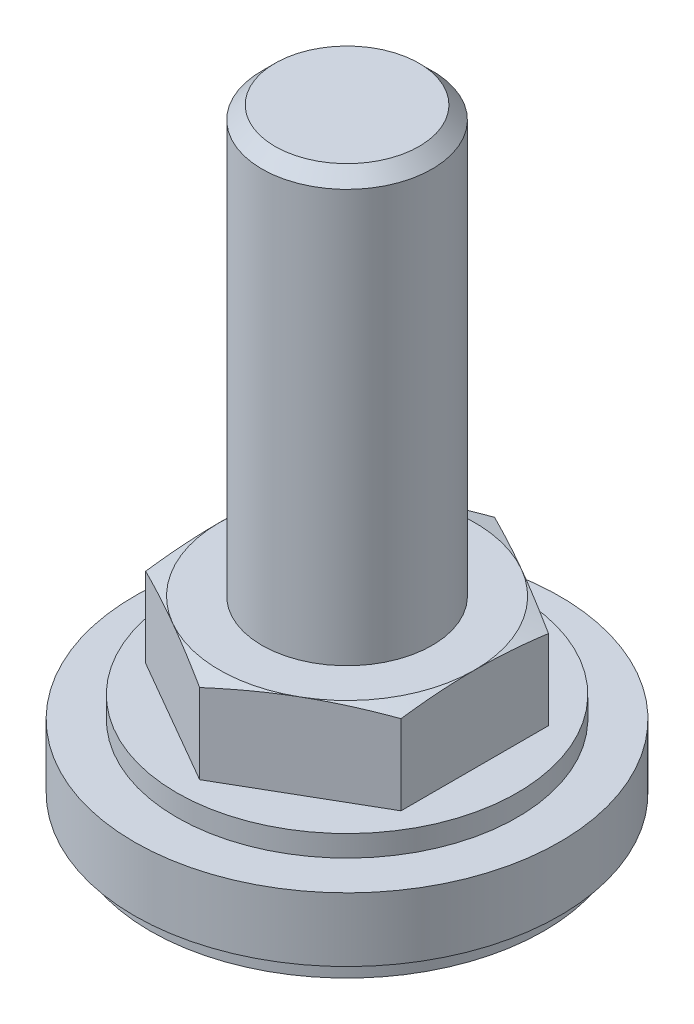
ISO-10303-21;
HEADER;
FILE_DESCRIPTION(('STEP AP214'),'2;1');
FILE_NAME('part.step','',(''),(''),'','','');
FILE_SCHEMA(('AUTOMOTIVE_DESIGN { 1 0 10303 214 1 1 1 1 }'));
ENDSEC;
DATA;
#1=APPLICATION_CONTEXT('core data for automotive mechanical design processes');
#2=APPLICATION_PROTOCOL_DEFINITION('international standard','automotive_design',2000,#1);
#3=PRODUCT_CONTEXT('',#1,'mechanical');
#4=PRODUCT('Part','Part','',(#3));
#5=PRODUCT_RELATED_PRODUCT_CATEGORY('part','',(#4));
#6=PRODUCT_DEFINITION_FORMATION('','',#4);
#7=PRODUCT_DEFINITION_CONTEXT('part definition',#1,'design');
#8=PRODUCT_DEFINITION('design','',#6,#7);
#9=PRODUCT_DEFINITION_SHAPE('','',#8);
#10=(LENGTH_UNIT() NAMED_UNIT(*) SI_UNIT(.MILLI.,.METRE.));
#11=(NAMED_UNIT(*) PLANE_ANGLE_UNIT() SI_UNIT($,.RADIAN.));
#12=(NAMED_UNIT(*) SI_UNIT($,.STERADIAN.) SOLID_ANGLE_UNIT());
#13=UNCERTAINTY_MEASURE_WITH_UNIT(LENGTH_MEASURE(1.E-05),#10,'distance_accuracy_value','');
#14=(GEOMETRIC_REPRESENTATION_CONTEXT(3) GLOBAL_UNCERTAINTY_ASSIGNED_CONTEXT((#13)) GLOBAL_UNIT_ASSIGNED_CONTEXT((#10,
#11,#12)) REPRESENTATION_CONTEXT('',''));
#15=CARTESIAN_POINT('',(0.,0.,0.));
#16=DIRECTION('',(0.,0.,1.));
#17=DIRECTION('',(1.,0.,0.));
#18=AXIS2_PLACEMENT_3D('',#15,#16,#17);
#19=CARTESIAN_POINT('',(15.,2.,0.));
#20=DIRECTION('',(0.,-1.,0.));
#21=DIRECTION('',(0.,0.,-1.));
#22=AXIS2_PLACEMENT_3D('',#19,#20,#21);
#23=PLANE('',#22);
#24=CARTESIAN_POINT('',(0.,2.,0.));
#25=DIRECTION('',(0.,1.,0.));
#26=DIRECTION('',(0.,0.,1.));
#27=AXIS2_PLACEMENT_3D('',#24,#25,#26);
#28=CIRCLE('',#27,16.);
#29=CARTESIAN_POINT('',(0.,2.,16.));
#30=VERTEX_POINT('',#29);
#31=EDGE_CURVE('E163',#30,#30,#28,.T.);
#32=ORIENTED_EDGE('',*,*,#31,.T.);
#33=EDGE_LOOP('',(#32));
#34=FACE_BOUND('',#33,.T.);
#35=DIRECTION('',(-0.866025403784439,0.,0.5));
#36=VECTOR('',#35,1.);
#37=CARTESIAN_POINT('',(0.,2.,-13.856406460551));
#38=LINE('',#37,#36);
#39=CARTESIAN_POINT('',(0.,2.,-13.856406460551));
#40=VERTEX_POINT('',#39);
#41=CARTESIAN_POINT('',(-12.,2.,-6.9282032302755));
#42=VERTEX_POINT('',#41);
#43=EDGE_CURVE('E124',#40,#42,#38,.T.);
#44=ORIENTED_EDGE('',*,*,#43,.F.);
#45=DIRECTION('',(-0.866025403784439,0.,-0.5));
#46=VECTOR('',#45,1.);
#47=CARTESIAN_POINT('',(12.,2.,-6.9282032302755));
#48=LINE('',#47,#46);
#49=CARTESIAN_POINT('',(12.,2.,-6.9282032302755));
#50=VERTEX_POINT('',#49);
#51=EDGE_CURVE('E139',#50,#40,#48,.T.);
#52=ORIENTED_EDGE('',*,*,#51,.F.);
#53=DIRECTION('',(0.,0.,-1.));
#54=VECTOR('',#53,1.);
#55=CARTESIAN_POINT('',(12.,2.,6.9282032302755));
#56=LINE('',#55,#54);
#57=CARTESIAN_POINT('',(12.,2.,6.9282032302755));
#58=VERTEX_POINT('',#57);
#59=EDGE_CURVE('E136',#58,#50,#56,.T.);
#60=ORIENTED_EDGE('',*,*,#59,.F.);
#61=DIRECTION('',(0.866025403784439,0.,-0.5));
#62=VECTOR('',#61,1.);
#63=CARTESIAN_POINT('',(0.,2.,13.856406460551));
#64=LINE('',#63,#62);
#65=CARTESIAN_POINT('',(0.,2.,13.856406460551));
#66=VERTEX_POINT('',#65);
#67=EDGE_CURVE('E133',#66,#58,#64,.T.);
#68=ORIENTED_EDGE('',*,*,#67,.F.);
#69=DIRECTION('',(0.866025403784439,0.,0.5));
#70=VECTOR('',#69,1.);
#71=CARTESIAN_POINT('',(-12.,2.,6.9282032302755));
#72=LINE('',#71,#70);
#73=CARTESIAN_POINT('',(-12.,2.,6.9282032302755));
#74=VERTEX_POINT('',#73);
#75=EDGE_CURVE('E127',#74,#66,#72,.T.);
#76=ORIENTED_EDGE('',*,*,#75,.F.);
#77=DIRECTION('',(0.,0.,1.));
#78=VECTOR('',#77,1.);
#79=CARTESIAN_POINT('',(-12.,2.,-6.9282032302755));
#80=LINE('',#79,#78);
#81=EDGE_CURVE('E113',#42,#74,#80,.T.);
#82=ORIENTED_EDGE('',*,*,#81,.F.);
#83=EDGE_LOOP('',(#44,#52,#60,#68,#76,#82));
#84=FACE_BOUND('',#83,.T.);
#85=ADVANCED_FACE('F35',(#34,#84),#23,.F.);
#86=CARTESIAN_POINT('',(0.,-8.,0.));
#87=DIRECTION('',(0.,1.,0.));
#88=DIRECTION('',(0.,0.,1.));
#89=AXIS2_PLACEMENT_3D('',#86,#87,#88);
#90=CYLINDRICAL_SURFACE('',#89,16.);
#91=ORIENTED_EDGE('',*,*,#31,.F.);
#92=EDGE_LOOP('',(#91));
#93=FACE_BOUND('',#92,.T.);
#94=CARTESIAN_POINT('',(0.,0.,0.));
#95=DIRECTION('',(0.,1.,0.));
#96=DIRECTION('',(0.,0.,1.));
#97=AXIS2_PLACEMENT_3D('',#94,#95,#96);
#98=CIRCLE('',#97,16.);
#99=CARTESIAN_POINT('',(0.,0.,16.));
#100=VERTEX_POINT('',#99);
#101=EDGE_CURVE('E160',#100,#100,#98,.T.);
#102=ORIENTED_EDGE('',*,*,#101,.T.);
#103=EDGE_LOOP('',(#102));
#104=FACE_BOUND('',#103,.T.);
#105=ADVANCED_FACE('F257',(#93,#104),#90,.T.);
#106=CARTESIAN_POINT('',(16.,0.,0.));
#107=DIRECTION('',(0.,-1.,0.));
#108=DIRECTION('',(0.,0.,-1.));
#109=AXIS2_PLACEMENT_3D('',#106,#107,#108);
#110=PLANE('',#109);
#111=ORIENTED_EDGE('',*,*,#101,.F.);
#112=EDGE_LOOP('',(#111));
#113=FACE_BOUND('',#112,.T.);
#114=CARTESIAN_POINT('',(0.,0.,0.));
#115=DIRECTION('',(0.,1.,0.));
#116=DIRECTION('',(0.,0.,1.));
#117=AXIS2_PLACEMENT_3D('',#114,#115,#116);
#118=CIRCLE('',#117,20.);
#119=CARTESIAN_POINT('',(0.,0.,20.));
#120=VERTEX_POINT('',#119);
#121=EDGE_CURVE('E157',#120,#120,#118,.T.);
#122=ORIENTED_EDGE('',*,*,#121,.T.);
#123=EDGE_LOOP('',(#122));
#124=FACE_BOUND('',#123,.T.);
#125=ADVANCED_FACE('F253',(#113,#124),#110,.F.);
#126=CARTESIAN_POINT('',(0.,-8.,0.));
#127=DIRECTION('',(0.,1.,0.));
#128=DIRECTION('',(0.,0.,1.));
#129=AXIS2_PLACEMENT_3D('',#126,#127,#128);
#130=CYLINDRICAL_SURFACE('',#129,20.);
#131=ORIENTED_EDGE('',*,*,#121,.F.);
#132=EDGE_LOOP('',(#131));
#133=FACE_BOUND('',#132,.T.);
#134=CARTESIAN_POINT('',(0.,-6.,0.));
#135=DIRECTION('',(0.,1.,0.));
#136=DIRECTION('',(0.,0.,1.));
#137=AXIS2_PLACEMENT_3D('',#134,#135,#136);
#138=CIRCLE('',#137,20.);
#139=CARTESIAN_POINT('',(0.,-6.,20.));
#140=VERTEX_POINT('',#139);
#141=EDGE_CURVE('E154',#140,#140,#138,.T.);
#142=ORIENTED_EDGE('',*,*,#141,.T.);
#143=EDGE_LOOP('',(#142));
#144=FACE_BOUND('',#143,.T.);
#145=ADVANCED_FACE('F249',(#133,#144),#130,.T.);
#146=CARTESIAN_POINT('',(20.,-6.,0.));
#147=DIRECTION('',(0.,1.,0.));
#148=DIRECTION('',(0.,0.,1.));
#149=AXIS2_PLACEMENT_3D('',#146,#147,#148);
#150=PLANE('',#149);
#151=ORIENTED_EDGE('',*,*,#141,.F.);
#152=EDGE_LOOP('',(#151));
#153=FACE_BOUND('',#152,.T.);
#154=CARTESIAN_POINT('',(0.,-6.,0.));
#155=DIRECTION('',(0.,1.,0.));
#156=DIRECTION('',(0.,0.,1.));
#157=AXIS2_PLACEMENT_3D('',#154,#155,#156);
#158=CIRCLE('',#157,18.5);
#159=CARTESIAN_POINT('',(0.,-6.,18.5));
#160=VERTEX_POINT('',#159);
#161=EDGE_CURVE('E151',#160,#160,#158,.T.);
#162=ORIENTED_EDGE('',*,*,#161,.T.);
#163=EDGE_LOOP('',(#162));
#164=FACE_BOUND('',#163,.T.);
#165=ADVANCED_FACE('F245',(#153,#164),#150,.F.);
#166=CARTESIAN_POINT('',(0.,-8.,0.));
#167=DIRECTION('',(0.,1.,0.));
#168=DIRECTION('',(0.,0.,1.));
#169=AXIS2_PLACEMENT_3D('',#166,#167,#168);
#170=CYLINDRICAL_SURFACE('',#169,18.5);
#171=ORIENTED_EDGE('',*,*,#161,.F.);
#172=EDGE_LOOP('',(#171));
#173=FACE_BOUND('',#172,.T.);
#174=CARTESIAN_POINT('',(0.,-8.,0.));
#175=DIRECTION('',(0.,1.,0.));
#176=DIRECTION('',(0.,0.,1.));
#177=AXIS2_PLACEMENT_3D('',#174,#175,#176);
#178=CIRCLE('',#177,18.5);
#179=CARTESIAN_POINT('',(0.,-8.,18.5));
#180=VERTEX_POINT('',#179);
#181=EDGE_CURVE('E117',#180,#180,#178,.T.);
#182=ORIENTED_EDGE('',*,*,#181,.T.);
#183=EDGE_LOOP('',(#182));
#184=FACE_BOUND('',#183,.T.);
#185=ADVANCED_FACE('F241',(#173,#184),#170,.T.);
#186=CARTESIAN_POINT('',(18.5,-8.,0.));
#187=DIRECTION('',(0.,1.,0.));
#188=DIRECTION('',(0.,0.,1.));
#189=AXIS2_PLACEMENT_3D('',#186,#187,#188);
#190=PLANE('',#189);
#191=ORIENTED_EDGE('',*,*,#181,.F.);
#192=EDGE_LOOP('',(#191));
#193=FACE_BOUND('',#192,.T.);
#194=ADVANCED_FACE('F238',(#193),#190,.F.);
#195=CARTESIAN_POINT('',(0.,12.,-13.856406460551));
#196=DIRECTION('',(0.5,0.,0.866025403784439));
#197=DIRECTION('',(0.866025403784439,0.,-0.5));
#198=AXIS2_PLACEMENT_3D('',#195,#196,#197);
#199=PLANE('',#198);
#200=DIRECTION('',(0.,-1.,0.));
#201=VECTOR('',#200,1.);
#202=CARTESIAN_POINT('',(0.,12.,-13.856406460551));
#203=LINE('',#202,#201);
#204=CARTESIAN_POINT('',(0.,9.50257738807142,-13.856406460551));
#205=VERTEX_POINT('',#204);
#206=EDGE_CURVE('E55',#205,#40,#203,.T.);
#207=ORIENTED_EDGE('',*,*,#206,.T.);
#208=ORIENTED_EDGE('',*,*,#43,.T.);
#209=DIRECTION('',(0.,-1.,0.));
#210=VECTOR('',#209,1.);
#211=CARTESIAN_POINT('',(-12.,12.,-6.9282032302755));
#212=LINE('',#211,#210);
#213=CARTESIAN_POINT('',(-12.,9.50257738807142,-6.9282032302755));
#214=VERTEX_POINT('',#213);
#215=EDGE_CURVE('E109',#214,#42,#212,.T.);
#216=ORIENTED_EDGE('',*,*,#215,.F.);
#217=CARTESIAN_POINT('',(0.0002,9.502546447577,-13.8565219306048));
#218=CARTESIAN_POINT('',(-0.498146454182598,9.57967201341545,-13.5688014711328));
#219=CARTESIAN_POINT('',(-0.997396444623649,9.64968920259278,-13.2805593547588));
#220=CARTESIAN_POINT('',(-1.99765949891959,9.77270272064879,-12.7030572111006));
#221=CARTESIAN_POINT('',(-2.49867319556912,9.82569213655645,-12.4137968184723));
#222=CARTESIAN_POINT('',(-3.49942613336508,9.91155672804192,-11.8360118404435));
#223=CARTESIAN_POINT('',(-3.99915860797725,9.94453429696096,-11.5474911617033));
#224=CARTESIAN_POINT('',(-4.99926081641629,9.98875383045164,-10.9700818824439));
#225=CARTESIAN_POINT('',(-5.49963040820814,10.,-10.6811933639286));
#226=CARTESIAN_POINT('',(-6.50036959179186,10.,-10.1034163268979));
#227=CARTESIAN_POINT('',(-7.00073918358372,9.98875383045164,-9.81452780838259));
#228=CARTESIAN_POINT('',(-8.00084139202275,9.94453429696096,-9.23711852912317));
#229=CARTESIAN_POINT('',(-8.50057386663493,9.91155672804192,-8.94859785038303));
#230=CARTESIAN_POINT('',(-9.50132680443088,9.82569213655644,-8.37081287235423));
#231=CARTESIAN_POINT('',(-10.0023405010804,9.77270272064879,-8.08155247972593));
#232=CARTESIAN_POINT('',(-11.0026035553764,9.64968920259278,-7.50405033606774));
#233=CARTESIAN_POINT('',(-11.5018535458174,9.57967201341545,-7.21580821969368));
#234=CARTESIAN_POINT('',(-12.0002,9.50254644757699,-6.92808776022166));
#235=B_SPLINE_CURVE_WITH_KNOTS('',3,(#217,#218,#219,#220,#221,#222,#223,#224,#225,#226,#227,
#228,#229,#230,#231,#232,#233,#234),.UNSPECIFIED.,.F.,.F.,(4,2,2,2,2,2,2,2,4),(0.,
1.74185054469228,3.48440735870376,5.21797126724055,6.95119970147062,8.6844281357007,
10.4179920442375,12.160548858249,13.9023994029412),.UNSPECIFIED.);
#236=CARTESIAN_POINT('',(-5.99999999999999,10.,-10.3923048454133));
#237=VERTEX_POINT('',#236);
#238=EDGE_CURVE('E39',#237,#214,#235,.T.);
#239=ORIENTED_EDGE('',*,*,#238,.F.);
#240=EDGE_CURVE('E11',#205,#237,#235,.T.);
#241=ORIENTED_EDGE('',*,*,#240,.F.);
#242=EDGE_LOOP('',(#207,#208,#216,#239,#241));
#243=FACE_BOUND('',#242,.T.);
#244=ADVANCED_FACE('F129',(#243),#199,.F.);
#245=CARTESIAN_POINT('',(-12.,12.,-6.9282032302755));
#246=DIRECTION('',(1.,0.,0.));
#247=DIRECTION('',(0.,0.,-1.));
#248=AXIS2_PLACEMENT_3D('',#245,#246,#247);
#249=PLANE('',#248);
#250=ORIENTED_EDGE('',*,*,#215,.T.);
#251=ORIENTED_EDGE('',*,*,#81,.T.);
#252=DIRECTION('',(0.,-1.,0.));
#253=VECTOR('',#252,1.);
#254=CARTESIAN_POINT('',(-12.,12.,6.9282032302755));
#255=LINE('',#254,#253);
#256=CARTESIAN_POINT('',(-12.,9.50257738807142,6.9282032302755));
#257=VERTEX_POINT('',#256);
#258=EDGE_CURVE('E118',#257,#74,#255,.T.);
#259=ORIENTED_EDGE('',*,*,#258,.F.);
#260=CARTESIAN_POINT('',(-12.,7.34291336878926,-18.3392424451288));
#261=CARTESIAN_POINT('',(-12.,7.46497416598954,-17.7947049298608));
#262=CARTESIAN_POINT('',(-12.,7.58554409265656,-17.2498271442394));
#263=CARTESIAN_POINT('',(-12.,7.82289745119727,-16.1592238953871));
#264=CARTESIAN_POINT('',(-12.,7.93968071989146,-15.6134983966845));
#265=CARTESIAN_POINT('',(-12.,8.16875730516581,-14.5205453408895));
#266=CARTESIAN_POINT('',(-12.,8.28104611977098,-13.9733168368444));
#267=CARTESIAN_POINT('',(-12.,8.49992361427309,-12.8777216682163));
#268=CARTESIAN_POINT('',(-12.,8.60651234215717,-12.3293550132554));
#269=CARTESIAN_POINT('',(-12.,8.81180976479946,-11.2356630729952));
#270=CARTESIAN_POINT('',(-12.,8.91057446126402,-10.6903483516512));
#271=CARTESIAN_POINT('',(-12.,9.09949648601524,-9.59821809665813));
#272=CARTESIAN_POINT('',(-12.,9.18965378238085,-9.05140255745101));
#273=CARTESIAN_POINT('',(-12.,9.3593294715239,-7.9561841148428));
#274=CARTESIAN_POINT('',(-12.,9.43884929024631,-7.40778143428582));
#275=CARTESIAN_POINT('',(-12.,9.58491017293832,-6.30923056644193));
#276=CARTESIAN_POINT('',(-12.,9.65145122425649,-5.75908237745407));
#277=CARTESIAN_POINT('',(-12.,9.76967287965021,-4.65082902866329));
#278=CARTESIAN_POINT('',(-12.,9.8211756015487,-4.0927046078178));
#279=CARTESIAN_POINT('',(-12.,9.90576919917668,-2.97505012677678));
#280=CARTESIAN_POINT('',(-12.,9.93886049717467,-2.41552009911471));
#281=CARTESIAN_POINT('',(-12.,9.98470135997272,-1.29586637312654));
#282=CARTESIAN_POINT('',(-12.,9.99746021195907,-0.735743062852353));
#283=CARTESIAN_POINT('',(-12.,10.0018514734413,0.384587539379194));
#284=CARTESIAN_POINT('',(-12.,9.99348390320361,0.944794831255471));
#285=CARTESIAN_POINT('',(-12.,9.95609280857339,2.06654492461966));
#286=CARTESIAN_POINT('',(-12.,9.92699428380419,2.628085175011));
#287=CARTESIAN_POINT('',(-12.,9.84980336617102,3.74984659854218));
#288=CARTESIAN_POINT('',(-12.,9.80171055196485,4.31006774214351));
#289=CARTESIAN_POINT('',(-12.,9.68896323837321,5.42918593727121));
#290=CARTESIAN_POINT('',(-12.,9.62429790423959,5.98808188023559));
#291=CARTESIAN_POINT('',(-12.,9.48109990669877,7.10407465120838));
#292=CARTESIAN_POINT('',(-12.,9.40256719974484,7.66117147356155));
#293=CARTESIAN_POINT('',(-12.,9.23961453136392,8.73752812609936));
#294=CARTESIAN_POINT('',(-12.,9.15590747706424,9.25689698586232));
#295=CARTESIAN_POINT('',(-12.,8.98035073248427,10.294263454863));
#296=CARTESIAN_POINT('',(-12.,8.8885008186478,10.8122610260507));
#297=CARTESIAN_POINT('',(-12.,8.69814696950537,11.8470802784052));
#298=CARTESIAN_POINT('',(-12.,8.599642360699,12.3639018350633));
#299=CARTESIAN_POINT('',(-12.,8.3972073697375,13.3964724543178));
#300=CARTESIAN_POINT('',(-12.,8.29327703700335,13.9122215266385));
#301=CARTESIAN_POINT('',(-12.,8.08094711168307,14.9429248833211));
#302=CARTESIAN_POINT('',(-12.,7.97254645648648,15.4578789481758));
#303=CARTESIAN_POINT('',(-12.,7.75207795037076,16.4870026127467));
#304=CARTESIAN_POINT('',(-12.,7.64001007807668,17.0011722078723));
#305=CARTESIAN_POINT('',(-12.,7.29929681010775,18.5426103722024));
#306=CARTESIAN_POINT('',(-12.,7.06612711042512,19.5688785132233));
#307=CARTESIAN_POINT('',(-12.,6.59370922187549,21.6093738155767));
#308=CARTESIAN_POINT('',(-12.,6.35454333578584,22.6236201570885));
#309=CARTESIAN_POINT('',(-12.,5.87022576012102,24.6506997888533));
#310=CARTESIAN_POINT('',(-12.,5.62507396088417,25.6635330528589));
#311=CARTESIAN_POINT('',(-12.,5.13064585349559,27.6868599239905));
#312=CARTESIAN_POINT('',(-12.,4.88137503425493,28.6973548750465));
#313=CARTESIAN_POINT('',(-12.,4.50495264739484,30.2124536801021));
#314=CARTESIAN_POINT('',(-12.,4.37906121183327,30.7173711972522));
#315=CARTESIAN_POINT('',(-12.,4.12653530428713,31.7270198362654));
#316=CARTESIAN_POINT('',(-12.,3.99990083310287,32.2317509583285));
#317=CARTESIAN_POINT('',(-12.,3.87294319801583,32.7364007742962));
#318=B_SPLINE_CURVE_WITH_KNOTS('',3,(#260,#261,#262,#263,#264,#265,#266,#267,#268,#269,#270,
#271,#272,#273,#274,#275,#276,#277,#278,#279,#280,#281,#282,#283,#284,#285,#286,#287,#288,#289,
#290,#291,#292,#293,#294,#295,#296,#297,#298,#299,#300,#301,#302,#303,#304,#305,#306,#307,#308,
#309,#310,#311,#312,#313,#314,#315,#316,#317),.UNSPECIFIED.,.F.,.F.,(4,2,2,2,2,2,2,2,2,2,2,2,2,
2,2,2,2,2,2,2,2,2,2,2,2,2,2,2,4),(0.,1.6741571784408,3.34838640617016,5.02425271091024,
6.70010490486635,8.36260910905425,10.0251194784959,11.6874067660146,13.3496956738876,
15.030916953375,16.7120996722342,18.3925142623134,20.0729272403843,21.7594506855859,
23.4460115443176,25.1336778647815,26.8213494849988,28.3994866240126,29.9776671030391,
31.5560075446455,33.134333612225,34.7130370404335,36.2917496720076,39.4489598327135,
42.5751286078005,45.7013546972023,48.8237058684811,50.3848310405374,51.9459545314085),.UNSPECIFIED.);
#319=CARTESIAN_POINT('',(-12.,10.,0.));
#320=VERTEX_POINT('',#319);
#321=EDGE_CURVE('E228',#320,#257,#318,.T.);
#322=ORIENTED_EDGE('',*,*,#321,.F.);
#323=EDGE_CURVE('E115',#214,#320,#318,.T.);
#324=ORIENTED_EDGE('',*,*,#323,.F.);
#325=EDGE_LOOP('',(#250,#251,#259,#322,#324));
#326=FACE_BOUND('',#325,.T.);
#327=ADVANCED_FACE('F111',(#326),#249,.F.);
#328=CARTESIAN_POINT('',(-12.,12.,6.9282032302755));
#329=DIRECTION('',(0.5,0.,-0.866025403784439));
#330=DIRECTION('',(-0.866025403784439,0.,-0.5));
#331=AXIS2_PLACEMENT_3D('',#328,#329,#330);
#332=PLANE('',#331);
#333=ORIENTED_EDGE('',*,*,#258,.T.);
#334=ORIENTED_EDGE('',*,*,#75,.T.);
#335=DIRECTION('',(0.,-1.,0.));
#336=VECTOR('',#335,1.);
#337=CARTESIAN_POINT('',(0.,12.,13.856406460551));
#338=LINE('',#337,#336);
#339=CARTESIAN_POINT('',(0.,9.50257738807142,13.856406460551));
#340=VERTEX_POINT('',#339);
#341=EDGE_CURVE('E146',#340,#66,#338,.T.);
#342=ORIENTED_EDGE('',*,*,#341,.F.);
#343=CARTESIAN_POINT('',(-12.0002,9.50254644757699,6.92808776022166));
#344=CARTESIAN_POINT('',(-11.5018535458174,9.57967201341545,7.21580821969368));
#345=CARTESIAN_POINT('',(-11.0026035553763,9.64968920259278,7.50405033606774));
#346=CARTESIAN_POINT('',(-10.0023405010804,9.77270272064879,8.08155247972594));
#347=CARTESIAN_POINT('',(-9.50132680443088,9.82569213655644,8.37081287235423));
#348=CARTESIAN_POINT('',(-8.50057386663493,9.91155672804192,8.94859785038303));
#349=CARTESIAN_POINT('',(-8.00084139202275,9.94453429696096,9.23711852912317));
#350=CARTESIAN_POINT('',(-7.00073918358372,9.98875383045164,9.81452780838258));
#351=CARTESIAN_POINT('',(-6.50036959179186,10.,10.1034163268979));
#352=CARTESIAN_POINT('',(-5.49963040820814,10.,10.6811933639286));
#353=CARTESIAN_POINT('',(-4.99926081641629,9.98875383045164,10.9700818824439));
#354=CARTESIAN_POINT('',(-3.99915860797726,9.94453429696096,11.5474911617033));
#355=CARTESIAN_POINT('',(-3.49942613336507,9.91155672804192,11.8360118404435));
#356=CARTESIAN_POINT('',(-2.49867319556912,9.82569213655645,12.4137968184723));
#357=CARTESIAN_POINT('',(-1.99765949891959,9.77270272064879,12.7030572111006));
#358=CARTESIAN_POINT('',(-0.997396444623651,9.64968920259278,13.2805593547588));
#359=CARTESIAN_POINT('',(-0.498146454182601,9.57967201341545,13.5688014711328));
#360=CARTESIAN_POINT('',(0.000199999999998418,9.502546447577,13.8565219306048));
#361=B_SPLINE_CURVE_WITH_KNOTS('',3,(#343,#344,#345,#346,#347,#348,#349,#350,#351,#352,#353,
#354,#355,#356,#357,#358,#359,#360),.UNSPECIFIED.,.F.,.F.,(4,2,2,2,2,2,2,2,4),(0.,
1.74185054469229,3.48440735870376,5.21797126724055,6.95119970147062,8.68442813570069,
10.4179920442375,12.160548858249,13.9023994029412),.UNSPECIFIED.);
#362=CARTESIAN_POINT('',(-5.99999999999999,10.,10.3923048454133));
#363=VERTEX_POINT('',#362);
#364=EDGE_CURVE('E222',#363,#340,#361,.T.);
#365=ORIENTED_EDGE('',*,*,#364,.F.);
#366=EDGE_CURVE('E227',#257,#363,#361,.T.);
#367=ORIENTED_EDGE('',*,*,#366,.F.);
#368=EDGE_LOOP('',(#333,#334,#342,#365,#367));
#369=FACE_BOUND('',#368,.T.);
#370=ADVANCED_FACE('F210',(#369),#332,.F.);
#371=CARTESIAN_POINT('',(0.,12.,13.856406460551));
#372=DIRECTION('',(-0.5,0.,-0.866025403784439));
#373=DIRECTION('',(-0.866025403784439,0.,0.5));
#374=AXIS2_PLACEMENT_3D('',#371,#372,#373);
#375=PLANE('',#374);
#376=ORIENTED_EDGE('',*,*,#341,.T.);
#377=ORIENTED_EDGE('',*,*,#67,.T.);
#378=DIRECTION('',(0.,-1.,0.));
#379=VECTOR('',#378,1.);
#380=CARTESIAN_POINT('',(12.,12.,6.9282032302755));
#381=LINE('',#380,#379);
#382=CARTESIAN_POINT('',(12.,9.50257738807142,6.9282032302755));
#383=VERTEX_POINT('',#382);
#384=EDGE_CURVE('E144',#383,#58,#381,.T.);
#385=ORIENTED_EDGE('',*,*,#384,.F.);
#386=CARTESIAN_POINT('',(-0.0002,9.502546447577,13.8565219306048));
#387=CARTESIAN_POINT('',(0.498146454182598,9.57967201341545,13.5688014711328));
#388=CARTESIAN_POINT('',(0.997396444623649,9.64968920259278,13.2805593547588));
#389=CARTESIAN_POINT('',(1.99765949891959,9.77270272064879,12.7030572111006));
#390=CARTESIAN_POINT('',(2.49867319556912,9.82569213655645,12.4137968184723));
#391=CARTESIAN_POINT('',(3.49942613336508,9.91155672804192,11.8360118404435));
#392=CARTESIAN_POINT('',(3.99915860797725,9.94453429696096,11.5474911617033));
#393=CARTESIAN_POINT('',(4.99926081641629,9.98875383045164,10.9700818824439));
#394=CARTESIAN_POINT('',(5.49963040820814,10.,10.6811933639286));
#395=CARTESIAN_POINT('',(6.50036959179186,10.,10.1034163268979));
#396=CARTESIAN_POINT('',(7.00073918358372,9.98875383045164,9.81452780838259));
#397=CARTESIAN_POINT('',(8.00084139202275,9.94453429696096,9.23711852912317));
#398=CARTESIAN_POINT('',(8.50057386663493,9.91155672804192,8.94859785038303));
#399=CARTESIAN_POINT('',(9.50132680443088,9.82569213655644,8.37081287235423));
#400=CARTESIAN_POINT('',(10.0023405010804,9.77270272064879,8.08155247972593));
#401=CARTESIAN_POINT('',(11.0026035553764,9.64968920259278,7.50405033606774));
#402=CARTESIAN_POINT('',(11.5018535458174,9.57967201341545,7.21580821969368));
#403=CARTESIAN_POINT('',(12.0002,9.50254644757699,6.92808776022166));
#404=B_SPLINE_CURVE_WITH_KNOTS('',3,(#386,#387,#388,#389,#390,#391,#392,#393,#394,#395,#396,
#397,#398,#399,#400,#401,#402,#403),.UNSPECIFIED.,.F.,.F.,(4,2,2,2,2,2,2,2,4),(0.,
1.74185054469228,3.48440735870376,5.21797126724055,6.95119970147062,8.6844281357007,
10.4179920442375,12.160548858249,13.9023994029412),.UNSPECIFIED.);
#405=CARTESIAN_POINT('',(5.99999999999999,10.,10.3923048454133));
#406=VERTEX_POINT('',#405);
#407=EDGE_CURVE('E214',#406,#383,#404,.T.);
#408=ORIENTED_EDGE('',*,*,#407,.F.);
#409=EDGE_CURVE('E220',#340,#406,#404,.T.);
#410=ORIENTED_EDGE('',*,*,#409,.F.);
#411=EDGE_LOOP('',(#376,#377,#385,#408,#410));
#412=FACE_BOUND('',#411,.T.);
#413=ADVANCED_FACE('F205',(#412),#375,.F.);
#414=CARTESIAN_POINT('',(12.,12.,6.9282032302755));
#415=DIRECTION('',(-1.,0.,0.));
#416=DIRECTION('',(0.,0.,1.));
#417=AXIS2_PLACEMENT_3D('',#414,#415,#416);
#418=PLANE('',#417);
#419=ORIENTED_EDGE('',*,*,#384,.T.);
#420=ORIENTED_EDGE('',*,*,#59,.T.);
#421=DIRECTION('',(0.,-1.,0.));
#422=VECTOR('',#421,1.);
#423=CARTESIAN_POINT('',(12.,12.,-6.9282032302755));
#424=LINE('',#423,#422);
#425=CARTESIAN_POINT('',(12.,9.50257738807142,-6.9282032302755));
#426=VERTEX_POINT('',#425);
#427=EDGE_CURVE('E142',#426,#50,#424,.T.);
#428=ORIENTED_EDGE('',*,*,#427,.F.);
#429=CARTESIAN_POINT('',(12.,7.34291336878926,-18.3392424451288));
#430=CARTESIAN_POINT('',(12.,7.46497416598954,-17.7947049298608));
#431=CARTESIAN_POINT('',(12.,7.58554409265656,-17.2498271442394));
#432=CARTESIAN_POINT('',(12.,7.82289745119727,-16.1592238953871));
#433=CARTESIAN_POINT('',(12.,7.93968071989146,-15.6134983966845));
#434=CARTESIAN_POINT('',(12.,8.16875730516581,-14.5205453408895));
#435=CARTESIAN_POINT('',(12.,8.28104611977098,-13.9733168368444));
#436=CARTESIAN_POINT('',(12.,8.49992361427309,-12.8777216682163));
#437=CARTESIAN_POINT('',(12.,8.60651234215717,-12.3293550132554));
#438=CARTESIAN_POINT('',(12.,8.81180976479946,-11.2356630729952));
#439=CARTESIAN_POINT('',(12.,8.91057446126402,-10.6903483516512));
#440=CARTESIAN_POINT('',(12.,9.09949648601524,-9.59821809665813));
#441=CARTESIAN_POINT('',(12.,9.18965378238085,-9.05140255745101));
#442=CARTESIAN_POINT('',(12.,9.3593294715239,-7.9561841148428));
#443=CARTESIAN_POINT('',(12.,9.43884929024631,-7.40778143428582));
#444=CARTESIAN_POINT('',(12.,9.58491017293832,-6.30923056644193));
#445=CARTESIAN_POINT('',(12.,9.65145122425649,-5.75908237745407));
#446=CARTESIAN_POINT('',(12.,9.76967287965021,-4.65082902866329));
#447=CARTESIAN_POINT('',(12.,9.8211756015487,-4.0927046078178));
#448=CARTESIAN_POINT('',(12.,9.90576919917668,-2.97505012677678));
#449=CARTESIAN_POINT('',(12.,9.93886049717467,-2.41552009911471));
#450=CARTESIAN_POINT('',(12.,9.98470135997272,-1.29586637312654));
#451=CARTESIAN_POINT('',(12.,9.99746021195907,-0.735743062852353));
#452=CARTESIAN_POINT('',(12.,10.0018514734413,0.384587539379194));
#453=CARTESIAN_POINT('',(12.,9.99348390320361,0.944794831255471));
#454=CARTESIAN_POINT('',(12.,9.95609280857339,2.06654492461966));
#455=CARTESIAN_POINT('',(12.,9.92699428380419,2.628085175011));
#456=CARTESIAN_POINT('',(12.,9.84980336617102,3.74984659854218));
#457=CARTESIAN_POINT('',(12.,9.80171055196485,4.31006774214351));
#458=CARTESIAN_POINT('',(12.,9.68896323837321,5.42918593727121));
#459=CARTESIAN_POINT('',(12.,9.62429790423959,5.98808188023559));
#460=CARTESIAN_POINT('',(12.,9.48109990669877,7.10407465120838));
#461=CARTESIAN_POINT('',(12.,9.40256719974484,7.66117147356155));
#462=CARTESIAN_POINT('',(12.,9.23961453136392,8.73752812609936));
#463=CARTESIAN_POINT('',(12.,9.15590747706424,9.25689698586232));
#464=CARTESIAN_POINT('',(12.,8.98035073248427,10.294263454863));
#465=CARTESIAN_POINT('',(12.,8.8885008186478,10.8122610260507));
#466=CARTESIAN_POINT('',(12.,8.69814696950537,11.8470802784052));
#467=CARTESIAN_POINT('',(12.,8.599642360699,12.3639018350633));
#468=CARTESIAN_POINT('',(12.,8.3972073697375,13.3964724543178));
#469=CARTESIAN_POINT('',(12.,8.29327703700335,13.9122215266385));
#470=CARTESIAN_POINT('',(12.,8.08094711168307,14.9429248833211));
#471=CARTESIAN_POINT('',(12.,7.97254645648648,15.4578789481758));
#472=CARTESIAN_POINT('',(12.,7.75207795037076,16.4870026127467));
#473=CARTESIAN_POINT('',(12.,7.64001007807668,17.0011722078723));
#474=CARTESIAN_POINT('',(12.,7.29929681010775,18.5426103722024));
#475=CARTESIAN_POINT('',(12.,7.06612711042512,19.5688785132233));
#476=CARTESIAN_POINT('',(12.,6.59370922187549,21.6093738155767));
#477=CARTESIAN_POINT('',(12.,6.35454333578584,22.6236201570885));
#478=CARTESIAN_POINT('',(12.,5.87022576012102,24.6506997888533));
#479=CARTESIAN_POINT('',(12.,5.62507396088417,25.6635330528589));
#480=CARTESIAN_POINT('',(12.,5.13064585349559,27.6868599239905));
#481=CARTESIAN_POINT('',(12.,4.88137503425493,28.6973548750465));
#482=CARTESIAN_POINT('',(12.,4.50495264739484,30.2124536801021));
#483=CARTESIAN_POINT('',(12.,4.37906121183327,30.7173711972522));
#484=CARTESIAN_POINT('',(12.,4.12653530428713,31.7270198362654));
#485=CARTESIAN_POINT('',(12.,3.99990083310287,32.2317509583285));
#486=CARTESIAN_POINT('',(12.,3.87294319801583,32.7364007742962));
#487=B_SPLINE_CURVE_WITH_KNOTS('',3,(#429,#430,#431,#432,#433,#434,#435,#436,#437,#438,#439,
#440,#441,#442,#443,#444,#445,#446,#447,#448,#449,#450,#451,#452,#453,#454,#455,#456,#457,#458,
#459,#460,#461,#462,#463,#464,#465,#466,#467,#468,#469,#470,#471,#472,#473,#474,#475,#476,#477,
#478,#479,#480,#481,#482,#483,#484,#485,#486),.UNSPECIFIED.,.F.,.F.,(4,2,2,2,2,2,2,2,2,2,2,2,2,
2,2,2,2,2,2,2,2,2,2,2,2,2,2,2,4),(0.,1.6741571784408,3.34838640617016,5.02425271091024,
6.70010490486635,8.36260910905425,10.0251194784959,11.6874067660146,13.3496956738876,
15.030916953375,16.7120996722342,18.3925142623134,20.0729272403843,21.7594506855859,
23.4460115443176,25.1336778647815,26.8213494849988,28.3994866240126,29.9776671030391,
31.5560075446455,33.134333612225,34.7130370404335,36.2917496720076,39.4489598327135,
42.5751286078005,45.7013546972023,48.8237058684811,50.3848310405374,51.9459545314085),.UNSPECIFIED.);
#488=CARTESIAN_POINT('',(12.,10.,0.));
#489=VERTEX_POINT('',#488);
#490=EDGE_CURVE('E188',#489,#426,#487,.F.);
#491=ORIENTED_EDGE('',*,*,#490,.F.);
#492=EDGE_CURVE('E221',#383,#489,#487,.F.);
#493=ORIENTED_EDGE('',*,*,#492,.F.);
#494=EDGE_LOOP('',(#419,#420,#428,#491,#493));
#495=FACE_BOUND('',#494,.T.);
#496=ADVANCED_FACE('F201',(#495),#418,.F.);
#497=CARTESIAN_POINT('',(12.,12.,-6.9282032302755));
#498=DIRECTION('',(-0.5,0.,0.866025403784439));
#499=DIRECTION('',(0.866025403784439,0.,0.5));
#500=AXIS2_PLACEMENT_3D('',#497,#498,#499);
#501=PLANE('',#500);
#502=ORIENTED_EDGE('',*,*,#427,.T.);
#503=ORIENTED_EDGE('',*,*,#51,.T.);
#504=ORIENTED_EDGE('',*,*,#206,.F.);
#505=CARTESIAN_POINT('',(12.0002,9.50254644757699,-6.92808776022166));
#506=CARTESIAN_POINT('',(11.5018535458174,9.57967201341545,-7.21580821969368));
#507=CARTESIAN_POINT('',(11.0026035553763,9.64968920259278,-7.50405033606774));
#508=CARTESIAN_POINT('',(10.0023405010804,9.77270272064879,-8.08155247972594));
#509=CARTESIAN_POINT('',(9.50132680443088,9.82569213655644,-8.37081287235423));
#510=CARTESIAN_POINT('',(8.50057386663493,9.91155672804192,-8.94859785038303));
#511=CARTESIAN_POINT('',(8.00084139202275,9.94453429696096,-9.23711852912317));
#512=CARTESIAN_POINT('',(7.00073918358372,9.98875383045164,-9.81452780838258));
#513=CARTESIAN_POINT('',(6.50036959179186,10.,-10.1034163268979));
#514=CARTESIAN_POINT('',(5.49963040820814,10.,-10.6811933639286));
#515=CARTESIAN_POINT('',(4.99926081641629,9.98875383045164,-10.9700818824439));
#516=CARTESIAN_POINT('',(3.99915860797726,9.94453429696096,-11.5474911617033));
#517=CARTESIAN_POINT('',(3.49942613336507,9.91155672804192,-11.8360118404435));
#518=CARTESIAN_POINT('',(2.49867319556912,9.82569213655645,-12.4137968184723));
#519=CARTESIAN_POINT('',(1.99765949891959,9.77270272064879,-12.7030572111006));
#520=CARTESIAN_POINT('',(0.997396444623651,9.64968920259278,-13.2805593547588));
#521=CARTESIAN_POINT('',(0.498146454182601,9.57967201341545,-13.5688014711328));
#522=CARTESIAN_POINT('',(-0.000199999999998418,9.502546447577,-13.8565219306048));
#523=B_SPLINE_CURVE_WITH_KNOTS('',3,(#505,#506,#507,#508,#509,#510,#511,#512,#513,#514,#515,
#516,#517,#518,#519,#520,#521,#522),.UNSPECIFIED.,.F.,.F.,(4,2,2,2,2,2,2,2,4),(0.,
1.74185054469229,3.48440735870376,5.21797126724055,6.95119970147062,8.68442813570069,
10.4179920442375,12.160548858249,13.9023994029412),.UNSPECIFIED.);
#524=CARTESIAN_POINT('',(5.99999999999999,10.,-10.3923048454133));
#525=VERTEX_POINT('',#524);
#526=EDGE_CURVE('E180',#525,#205,#523,.T.);
#527=ORIENTED_EDGE('',*,*,#526,.F.);
#528=EDGE_CURVE('E187',#426,#525,#523,.T.);
#529=ORIENTED_EDGE('',*,*,#528,.F.);
#530=EDGE_LOOP('',(#502,#503,#504,#527,#529));
#531=FACE_BOUND('',#530,.T.);
#532=ADVANCED_FACE('F198',(#531),#501,.F.);
#533=CARTESIAN_POINT('',(0.,50.,0.));
#534=DIRECTION('',(0.,-1.,0.));
#535=DIRECTION('',(0.,0.,-1.));
#536=AXIS2_PLACEMENT_3D('',#533,#534,#535);
#537=PLANE('',#536);
#538=CARTESIAN_POINT('',(0.,50.,0.));
#539=DIRECTION('',(0.,1.,0.));
#540=DIRECTION('',(0.,0.,1.));
#541=AXIS2_PLACEMENT_3D('',#538,#539,#540);
#542=CIRCLE('',#541,6.773);
#543=CARTESIAN_POINT('',(0.,50.,6.773));
#544=VERTEX_POINT('',#543);
#545=EDGE_CURVE('E177',#544,#544,#542,.T.);
#546=ORIENTED_EDGE('',*,*,#545,.T.);
#547=EDGE_LOOP('',(#546));
#548=FACE_BOUND('',#547,.T.);
#549=ADVANCED_FACE('F37',(#548),#537,.F.);
#550=CARTESIAN_POINT('',(0.,48.773,0.));
#551=DIRECTION('',(0.,-1.,0.));
#552=DIRECTION('',(0.,0.,-1.));
#553=AXIS2_PLACEMENT_3D('',#550,#551,#552);
#554=CONICAL_SURFACE('',#553,8.,0.785398163397446);
#555=ORIENTED_EDGE('',*,*,#545,.F.);
#556=EDGE_LOOP('',(#555));
#557=FACE_BOUND('',#556,.T.);
#558=CARTESIAN_POINT('',(0.,48.773,0.));
#559=DIRECTION('',(0.,1.,0.));
#560=DIRECTION('',(0.,0.,1.));
#561=AXIS2_PLACEMENT_3D('',#558,#559,#560);
#562=CIRCLE('',#561,8.);
#563=CARTESIAN_POINT('',(0.,48.773,8.));
#564=VERTEX_POINT('',#563);
#565=EDGE_CURVE('E174',#564,#564,#562,.T.);
#566=ORIENTED_EDGE('',*,*,#565,.T.);
#567=EDGE_LOOP('',(#566));
#568=FACE_BOUND('',#567,.T.);
#569=ADVANCED_FACE('F334',(#557,#568),#554,.T.);
#570=CARTESIAN_POINT('',(0.,-8.,0.));
#571=DIRECTION('',(0.,1.,0.));
#572=DIRECTION('',(0.,0.,1.));
#573=AXIS2_PLACEMENT_3D('',#570,#571,#572);
#574=CYLINDRICAL_SURFACE('',#573,8.);
#575=ORIENTED_EDGE('',*,*,#565,.F.);
#576=EDGE_LOOP('',(#575));
#577=FACE_BOUND('',#576,.T.);
#578=CARTESIAN_POINT('',(0.,10.,0.));
#579=DIRECTION('',(0.,1.,0.));
#580=DIRECTION('',(0.,0.,1.));
#581=AXIS2_PLACEMENT_3D('',#578,#579,#580);
#582=CIRCLE('',#581,8.);
#583=CARTESIAN_POINT('',(0.,10.,8.));
#584=VERTEX_POINT('',#583);
#585=EDGE_CURVE('E170',#584,#584,#582,.T.);
#586=ORIENTED_EDGE('',*,*,#585,.T.);
#587=EDGE_LOOP('',(#586));
#588=FACE_BOUND('',#587,.T.);
#589=ADVANCED_FACE('F341',(#577,#588),#574,.T.);
#590=CARTESIAN_POINT('',(0.,9.1961524227066,0.));
#591=DIRECTION('',(0.,-1.,0.));
#592=DIRECTION('',(0.,0.,-1.));
#593=AXIS2_PLACEMENT_3D('',#590,#591,#592);
#594=CONICAL_SURFACE('',#593,15.,1.30899693899574);
#595=CARTESIAN_POINT('',(0.,10.,0.));
#596=DIRECTION('',(0.,1.,0.));
#597=DIRECTION('',(0.,0.,1.));
#598=AXIS2_PLACEMENT_3D('',#595,#596,#597);
#599=CIRCLE('',#598,12.);
#600=EDGE_CURVE('E166',#363,#406,#599,.T.);
#601=ORIENTED_EDGE('',*,*,#600,.F.);
#602=ORIENTED_EDGE('',*,*,#364,.T.);
#603=ORIENTED_EDGE('',*,*,#409,.T.);
#604=EDGE_LOOP('',(#601,#602,#603));
#605=FACE_BOUND('',#604,.T.);
#606=ADVANCED_FACE('F347',(#605),#594,.T.);
#607=EDGE_CURVE('E465',#320,#363,#599,.T.);
#608=ORIENTED_EDGE('',*,*,#607,.F.);
#609=ORIENTED_EDGE('',*,*,#321,.T.);
#610=ORIENTED_EDGE('',*,*,#366,.T.);
#611=EDGE_LOOP('',(#608,#609,#610));
#612=FACE_BOUND('',#611,.T.);
#613=ADVANCED_FACE('F354',(#612),#594,.T.);
#614=EDGE_CURVE('E469',#237,#320,#599,.T.);
#615=ORIENTED_EDGE('',*,*,#614,.F.);
#616=ORIENTED_EDGE('',*,*,#238,.T.);
#617=ORIENTED_EDGE('',*,*,#323,.T.);
#618=EDGE_LOOP('',(#615,#616,#617));
#619=FACE_BOUND('',#618,.T.);
#620=ADVANCED_FACE('F362',(#619),#594,.T.);
#621=EDGE_CURVE('E171',#489,#525,#599,.T.);
#622=ORIENTED_EDGE('',*,*,#621,.F.);
#623=ORIENTED_EDGE('',*,*,#490,.T.);
#624=ORIENTED_EDGE('',*,*,#528,.T.);
#625=EDGE_LOOP('',(#622,#623,#624));
#626=FACE_BOUND('',#625,.T.);
#627=ADVANCED_FACE('F194',(#626),#594,.T.);
#628=EDGE_CURVE('E167',#406,#489,#599,.T.);
#629=ORIENTED_EDGE('',*,*,#628,.F.);
#630=ORIENTED_EDGE('',*,*,#407,.T.);
#631=ORIENTED_EDGE('',*,*,#492,.T.);
#632=EDGE_LOOP('',(#629,#630,#631));
#633=FACE_BOUND('',#632,.T.);
#634=ADVANCED_FACE('F356',(#633),#594,.T.);
#635=CARTESIAN_POINT('',(8.,10.,0.));
#636=DIRECTION('',(0.,-1.,0.));
#637=DIRECTION('',(0.,0.,-1.));
#638=AXIS2_PLACEMENT_3D('',#635,#636,#637);
#639=PLANE('',#638);
#640=ORIENTED_EDGE('',*,*,#585,.F.);
#641=EDGE_LOOP('',(#640));
#642=FACE_BOUND('',#641,.T.);
#643=ORIENTED_EDGE('',*,*,#628,.T.);
#644=ORIENTED_EDGE('',*,*,#621,.T.);
#645=EDGE_CURVE('E449',#525,#237,#599,.T.);
#646=ORIENTED_EDGE('',*,*,#645,.T.);
#647=ORIENTED_EDGE('',*,*,#614,.T.);
#648=ORIENTED_EDGE('',*,*,#607,.T.);
#649=ORIENTED_EDGE('',*,*,#600,.T.);
#650=EDGE_LOOP('',(#643,#644,#646,#647,#648,#649));
#651=FACE_BOUND('',#650,.T.);
#652=ADVANCED_FACE('F382',(#642,#651),#639,.F.);
#653=ORIENTED_EDGE('',*,*,#526,.T.);
#654=ORIENTED_EDGE('',*,*,#240,.T.);
#655=ORIENTED_EDGE('',*,*,#645,.F.);
#656=EDGE_LOOP('',(#653,#654,#655));
#657=FACE_BOUND('',#656,.T.);
#658=ADVANCED_FACE('F370',(#657),#594,.T.);
#659=CLOSED_SHELL('',(#85,#105,#125,#145,#165,#185,#194,#244,#327,#370,#413,#496,#532,#549,#569,
#589,#606,#613,#620,#627,#634,#652,#658));
#660=MANIFOLD_SOLID_BREP('B2',#659);
#661=ADVANCED_BREP_SHAPE_REPRESENTATION('',(#18,#660),#14);
#662=SHAPE_DEFINITION_REPRESENTATION(#9,#661);
ENDSEC;
END-ISO-10303-21;
